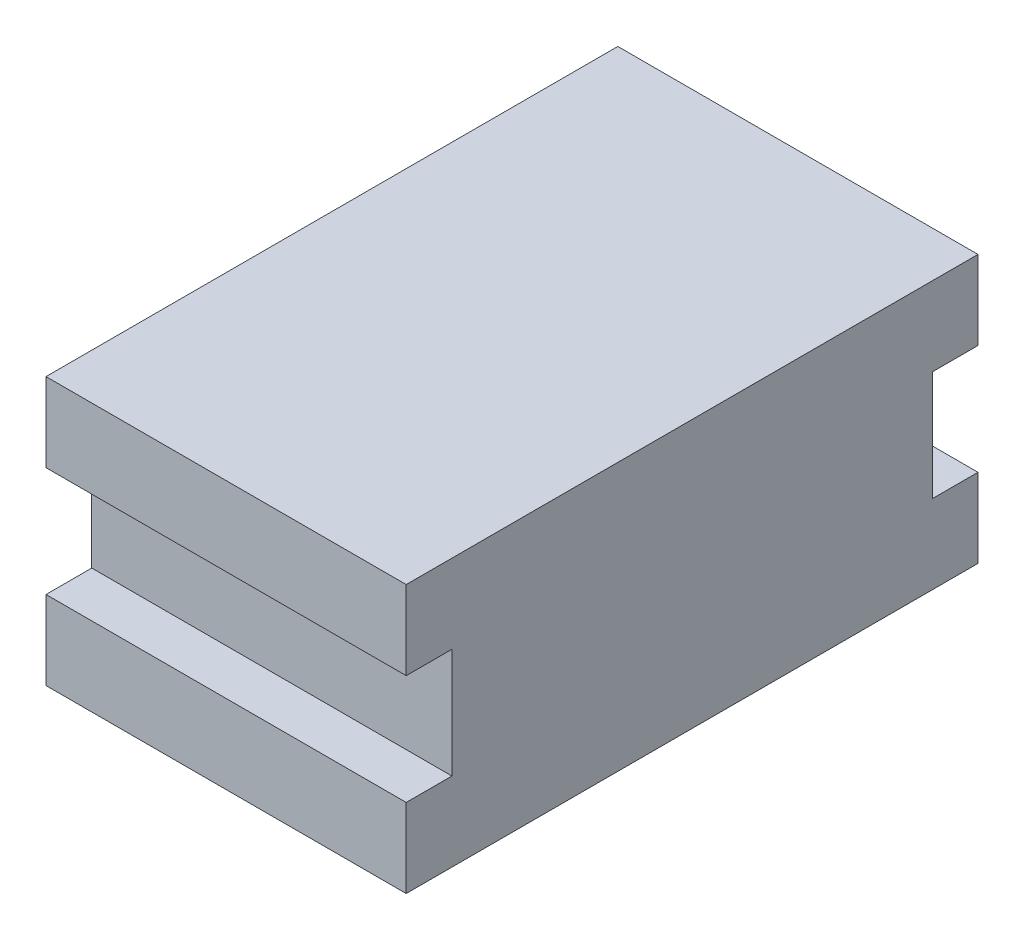
ISO-10303-21;
HEADER;
FILE_DESCRIPTION(('STEP AP214'),'2;1');
FILE_NAME('part.step','',(''),(''),'','','');
FILE_SCHEMA(('AUTOMOTIVE_DESIGN { 1 0 10303 214 1 1 1 1 }'));
ENDSEC;
DATA;
#1=APPLICATION_CONTEXT('core data for automotive mechanical design processes');
#2=APPLICATION_PROTOCOL_DEFINITION('international standard','automotive_design',2000,#1);
#3=PRODUCT_CONTEXT('',#1,'mechanical');
#4=PRODUCT('Part','Part','',(#3));
#5=PRODUCT_RELATED_PRODUCT_CATEGORY('part','',(#4));
#6=PRODUCT_DEFINITION_FORMATION('','',#4);
#7=PRODUCT_DEFINITION_CONTEXT('part definition',#1,'design');
#8=PRODUCT_DEFINITION('design','',#6,#7);
#9=PRODUCT_DEFINITION_SHAPE('','',#8);
#10=(LENGTH_UNIT() NAMED_UNIT(*) SI_UNIT(.MILLI.,.METRE.));
#11=(NAMED_UNIT(*) PLANE_ANGLE_UNIT() SI_UNIT($,.RADIAN.));
#12=(NAMED_UNIT(*) SI_UNIT($,.STERADIAN.) SOLID_ANGLE_UNIT());
#13=UNCERTAINTY_MEASURE_WITH_UNIT(LENGTH_MEASURE(1.E-05),#10,'distance_accuracy_value','');
#14=(GEOMETRIC_REPRESENTATION_CONTEXT(3) GLOBAL_UNCERTAINTY_ASSIGNED_CONTEXT((#13)) GLOBAL_UNIT_ASSIGNED_CONTEXT((#10,
#11,#12)) REPRESENTATION_CONTEXT('',''));
#15=CARTESIAN_POINT('',(0.,0.,0.));
#16=DIRECTION('',(0.,0.,1.));
#17=DIRECTION('',(1.,0.,0.));
#18=AXIS2_PLACEMENT_3D('',#15,#16,#17);
#19=CARTESIAN_POINT('',(0.999998,1.04775,-1.3335));
#20=DIRECTION('',(0.,1.,0.));
#21=DIRECTION('',(0.,0.,1.));
#22=AXIS2_PLACEMENT_3D('',#19,#20,#21);
#23=PLANE('',#22);
#24=DIRECTION('',(1.,0.,0.));
#25=VECTOR('',#24,1.);
#26=CARTESIAN_POINT('',(0.999998,1.04775,-1.5875));
#27=LINE('',#26,#25);
#28=CARTESIAN_POINT('',(-0.999998,1.04775,-1.5875));
#29=VERTEX_POINT('',#28);
#30=CARTESIAN_POINT('',(0.999998,1.04775,-1.5875));
#31=VERTEX_POINT('',#30);
#32=EDGE_CURVE('E145',#29,#31,#27,.T.);
#33=ORIENTED_EDGE('',*,*,#32,.T.);
#34=DIRECTION('',(0.,0.,1.));
#35=VECTOR('',#34,1.);
#36=CARTESIAN_POINT('',(0.999998,1.04775,-1.3335));
#37=LINE('',#36,#35);
#38=CARTESIAN_POINT('',(0.999998,1.04775,-1.3335));
#39=VERTEX_POINT('',#38);
#40=EDGE_CURVE('E20',#39,#31,#37,.F.);
#41=ORIENTED_EDGE('',*,*,#40,.F.);
#42=DIRECTION('',(1.,0.,0.));
#43=VECTOR('',#42,1.);
#44=CARTESIAN_POINT('',(0.999998,1.04775,-1.3335));
#45=LINE('',#44,#43);
#46=CARTESIAN_POINT('',(-0.999998,1.04775,-1.3335));
#47=VERTEX_POINT('',#46);
#48=EDGE_CURVE('E153',#39,#47,#45,.F.);
#49=ORIENTED_EDGE('',*,*,#48,.T.);
#50=DIRECTION('',(0.,0.,1.));
#51=VECTOR('',#50,1.);
#52=CARTESIAN_POINT('',(-0.999998,1.04775,-1.3335));
#53=LINE('',#52,#51);
#54=EDGE_CURVE('E115',#29,#47,#53,.T.);
#55=ORIENTED_EDGE('',*,*,#54,.F.);
#56=EDGE_LOOP('',(#33,#41,#49,#55));
#57=FACE_BOUND('',#56,.T.);
#58=ADVANCED_FACE('F17',(#57),#23,.F.);
#59=CARTESIAN_POINT('',(0.999998,1.04775,1.5875));
#60=DIRECTION('',(0.,1.,0.));
#61=DIRECTION('',(0.,0.,1.));
#62=AXIS2_PLACEMENT_3D('',#59,#60,#61);
#63=PLANE('',#62);
#64=DIRECTION('',(-1.,0.,0.));
#65=VECTOR('',#64,1.);
#66=CARTESIAN_POINT('',(0.999998,1.04775,1.3335));
#67=LINE('',#66,#65);
#68=CARTESIAN_POINT('',(-0.999998,1.04775,1.3335));
#69=VERTEX_POINT('',#68);
#70=CARTESIAN_POINT('',(0.999998,1.04775,1.3335));
#71=VERTEX_POINT('',#70);
#72=EDGE_CURVE('E120',#69,#71,#67,.F.);
#73=ORIENTED_EDGE('',*,*,#72,.T.);
#74=DIRECTION('',(0.,0.,1.));
#75=VECTOR('',#74,1.);
#76=CARTESIAN_POINT('',(0.999998,1.04775,1.5875));
#77=LINE('',#76,#75);
#78=CARTESIAN_POINT('',(0.999998,1.04775,1.5875));
#79=VERTEX_POINT('',#78);
#80=EDGE_CURVE('E107',#79,#71,#77,.F.);
#81=ORIENTED_EDGE('',*,*,#80,.F.);
#82=DIRECTION('',(-1.,0.,0.));
#83=VECTOR('',#82,1.);
#84=CARTESIAN_POINT('',(0.999998,1.04775,1.5875));
#85=LINE('',#84,#83);
#86=CARTESIAN_POINT('',(-0.999998,1.04775,1.5875));
#87=VERTEX_POINT('',#86);
#88=EDGE_CURVE('E171',#79,#87,#85,.T.);
#89=ORIENTED_EDGE('',*,*,#88,.T.);
#90=DIRECTION('',(0.,0.,1.));
#91=VECTOR('',#90,1.);
#92=CARTESIAN_POINT('',(-0.999998,1.04775,1.5875));
#93=LINE('',#92,#91);
#94=EDGE_CURVE('E102',#69,#87,#93,.T.);
#95=ORIENTED_EDGE('',*,*,#94,.F.);
#96=EDGE_LOOP('',(#73,#81,#89,#95));
#97=FACE_BOUND('',#96,.T.);
#98=ADVANCED_FACE('F126',(#97),#63,.F.);
#99=CARTESIAN_POINT('',(0.999998,1.04775,1.3335));
#100=DIRECTION('',(0.,0.,-1.));
#101=DIRECTION('',(-1.,0.,0.));
#102=AXIS2_PLACEMENT_3D('',#99,#100,#101);
#103=PLANE('',#102);
#104=DIRECTION('',(1.,0.,0.));
#105=VECTOR('',#104,1.);
#106=CARTESIAN_POINT('',(0.999998,0.43815,1.3335));
#107=LINE('',#106,#105);
#108=CARTESIAN_POINT('',(-0.999998,0.43815,1.3335));
#109=VERTEX_POINT('',#108);
#110=CARTESIAN_POINT('',(0.999998,0.43815,1.3335));
#111=VERTEX_POINT('',#110);
#112=EDGE_CURVE('E123',#109,#111,#107,.T.);
#113=ORIENTED_EDGE('',*,*,#112,.T.);
#114=DIRECTION('',(0.,1.,0.));
#115=VECTOR('',#114,1.);
#116=CARTESIAN_POINT('',(0.999998,1.04775,1.3335));
#117=LINE('',#116,#115);
#118=EDGE_CURVE('E110',#71,#111,#117,.F.);
#119=ORIENTED_EDGE('',*,*,#118,.F.);
#120=ORIENTED_EDGE('',*,*,#72,.F.);
#121=DIRECTION('',(0.,1.,0.));
#122=VECTOR('',#121,1.);
#123=CARTESIAN_POINT('',(-0.999998,1.04775,1.3335));
#124=LINE('',#123,#122);
#125=EDGE_CURVE('E124',#109,#69,#124,.T.);
#126=ORIENTED_EDGE('',*,*,#125,.F.);
#127=EDGE_LOOP('',(#113,#119,#120,#126));
#128=FACE_BOUND('',#127,.T.);
#129=ADVANCED_FACE('F119',(#128),#103,.F.);
#130=CARTESIAN_POINT('',(0.999998,0.43815,-1.3335));
#131=DIRECTION('',(0.,0.,1.));
#132=DIRECTION('',(1.,0.,0.));
#133=AXIS2_PLACEMENT_3D('',#130,#131,#132);
#134=PLANE('',#133);
#135=ORIENTED_EDGE('',*,*,#48,.F.);
#136=DIRECTION('',(0.,1.,0.));
#137=VECTOR('',#136,1.);
#138=CARTESIAN_POINT('',(0.999998,0.43815,-1.3335));
#139=LINE('',#138,#137);
#140=CARTESIAN_POINT('',(0.999998,0.43815,-1.3335));
#141=VERTEX_POINT('',#140);
#142=EDGE_CURVE('E137',#141,#39,#139,.T.);
#143=ORIENTED_EDGE('',*,*,#142,.F.);
#144=DIRECTION('',(1.,0.,0.));
#145=VECTOR('',#144,1.);
#146=CARTESIAN_POINT('',(0.999998,0.43815,-1.3335));
#147=LINE('',#146,#145);
#148=CARTESIAN_POINT('',(-0.999998,0.43815,-1.3335));
#149=VERTEX_POINT('',#148);
#150=EDGE_CURVE('E189',#141,#149,#147,.F.);
#151=ORIENTED_EDGE('',*,*,#150,.T.);
#152=DIRECTION('',(0.,1.,0.));
#153=VECTOR('',#152,1.);
#154=CARTESIAN_POINT('',(-0.999998,0.43815,-1.3335));
#155=LINE('',#154,#153);
#156=EDGE_CURVE('E151',#47,#149,#155,.F.);
#157=ORIENTED_EDGE('',*,*,#156,.F.);
#158=EDGE_LOOP('',(#135,#143,#151,#157));
#159=FACE_BOUND('',#158,.T.);
#160=ADVANCED_FACE('F196',(#159),#134,.F.);
#161=CARTESIAN_POINT('',(0.999998,1.04775,-1.5875));
#162=DIRECTION('',(0.,0.,1.));
#163=DIRECTION('',(1.,0.,0.));
#164=AXIS2_PLACEMENT_3D('',#161,#162,#163);
#165=PLANE('',#164);
#166=DIRECTION('',(1.,0.,0.));
#167=VECTOR('',#166,1.);
#168=CARTESIAN_POINT('',(0.999998,1.4859,-1.5875));
#169=LINE('',#168,#167);
#170=CARTESIAN_POINT('',(-0.999998,1.4859,-1.5875));
#171=VERTEX_POINT('',#170);
#172=CARTESIAN_POINT('',(0.999998,1.4859,-1.5875));
#173=VERTEX_POINT('',#172);
#174=EDGE_CURVE('E147',#171,#173,#169,.T.);
#175=ORIENTED_EDGE('',*,*,#174,.T.);
#176=DIRECTION('',(0.,1.,0.));
#177=VECTOR('',#176,1.);
#178=CARTESIAN_POINT('',(0.999998,1.04775,-1.5875));
#179=LINE('',#178,#177);
#180=EDGE_CURVE('E134',#31,#173,#179,.T.);
#181=ORIENTED_EDGE('',*,*,#180,.F.);
#182=ORIENTED_EDGE('',*,*,#32,.F.);
#183=DIRECTION('',(0.,1.,0.));
#184=VECTOR('',#183,1.);
#185=CARTESIAN_POINT('',(-0.999998,1.04775,-1.5875));
#186=LINE('',#185,#184);
#187=EDGE_CURVE('E149',#171,#29,#186,.F.);
#188=ORIENTED_EDGE('',*,*,#187,.F.);
#189=EDGE_LOOP('',(#175,#181,#182,#188));
#190=FACE_BOUND('',#189,.T.);
#191=ADVANCED_FACE('F144',(#190),#165,.F.);
#192=CARTESIAN_POINT('',(0.999998,1.4859,1.5875));
#193=DIRECTION('',(0.,0.,-1.));
#194=DIRECTION('',(-1.,0.,0.));
#195=AXIS2_PLACEMENT_3D('',#192,#193,#194);
#196=PLANE('',#195);
#197=ORIENTED_EDGE('',*,*,#88,.F.);
#198=DIRECTION('',(0.,1.,0.));
#199=VECTOR('',#198,1.);
#200=CARTESIAN_POINT('',(0.999998,1.4859,1.5875));
#201=LINE('',#200,#199);
#202=CARTESIAN_POINT('',(0.999998,1.4859,1.5875));
#203=VERTEX_POINT('',#202);
#204=EDGE_CURVE('E113',#203,#79,#201,.F.);
#205=ORIENTED_EDGE('',*,*,#204,.F.);
#206=DIRECTION('',(1.,0.,0.));
#207=VECTOR('',#206,1.);
#208=CARTESIAN_POINT('',(0.999998,1.4859,1.5875));
#209=LINE('',#208,#207);
#210=CARTESIAN_POINT('',(-0.999998,1.4859,1.5875));
#211=VERTEX_POINT('',#210);
#212=EDGE_CURVE('E183',#203,#211,#209,.F.);
#213=ORIENTED_EDGE('',*,*,#212,.T.);
#214=DIRECTION('',(0.,1.,0.));
#215=VECTOR('',#214,1.);
#216=CARTESIAN_POINT('',(-0.999998,1.4859,1.5875));
#217=LINE('',#216,#215);
#218=EDGE_CURVE('E168',#87,#211,#217,.T.);
#219=ORIENTED_EDGE('',*,*,#218,.F.);
#220=EDGE_LOOP('',(#197,#205,#213,#219));
#221=FACE_BOUND('',#220,.T.);
#222=ADVANCED_FACE('F299',(#221),#196,.F.);
#223=CARTESIAN_POINT('',(0.999998,0.43815,1.3335));
#224=DIRECTION('',(0.,-1.,0.));
#225=DIRECTION('',(0.,0.,-1.));
#226=AXIS2_PLACEMENT_3D('',#223,#224,#225);
#227=PLANE('',#226);
#228=DIRECTION('',(-1.,0.,0.));
#229=VECTOR('',#228,1.);
#230=CARTESIAN_POINT('',(0.999998,0.43815,1.5875));
#231=LINE('',#230,#229);
#232=CARTESIAN_POINT('',(-0.999998,0.43815,1.5875));
#233=VERTEX_POINT('',#232);
#234=CARTESIAN_POINT('',(0.999998,0.43815,1.5875));
#235=VERTEX_POINT('',#234);
#236=EDGE_CURVE('E187',#233,#235,#231,.F.);
#237=ORIENTED_EDGE('',*,*,#236,.T.);
#238=DIRECTION('',(0.,0.,-1.));
#239=VECTOR('',#238,1.);
#240=CARTESIAN_POINT('',(0.999998,0.43815,1.3335));
#241=LINE('',#240,#239);
#242=EDGE_CURVE('E167',#111,#235,#241,.F.);
#243=ORIENTED_EDGE('',*,*,#242,.F.);
#244=ORIENTED_EDGE('',*,*,#112,.F.);
#245=DIRECTION('',(0.,0.,-1.));
#246=VECTOR('',#245,1.);
#247=CARTESIAN_POINT('',(-0.999998,0.43815,1.3335));
#248=LINE('',#247,#246);
#249=EDGE_CURVE('E162',#233,#109,#248,.T.);
#250=ORIENTED_EDGE('',*,*,#249,.F.);
#251=EDGE_LOOP('',(#237,#243,#244,#250));
#252=FACE_BOUND('',#251,.T.);
#253=ADVANCED_FACE('F165',(#252),#227,.F.);
#254=CARTESIAN_POINT('',(0.999998,0.43815,-1.5875));
#255=DIRECTION('',(0.,-1.,0.));
#256=DIRECTION('',(0.,0.,-1.));
#257=AXIS2_PLACEMENT_3D('',#254,#255,#256);
#258=PLANE('',#257);
#259=ORIENTED_EDGE('',*,*,#150,.F.);
#260=DIRECTION('',(0.,0.,-1.));
#261=VECTOR('',#260,1.);
#262=CARTESIAN_POINT('',(0.999998,0.43815,0.));
#263=LINE('',#262,#261);
#264=CARTESIAN_POINT('',(0.999998,0.43815,-1.5875));
#265=VERTEX_POINT('',#264);
#266=EDGE_CURVE('E201',#265,#141,#263,.F.);
#267=ORIENTED_EDGE('',*,*,#266,.F.);
#268=DIRECTION('',(1.,0.,0.));
#269=VECTOR('',#268,1.);
#270=CARTESIAN_POINT('',(0.999998,0.43815,-1.5875));
#271=LINE('',#270,#269);
#272=CARTESIAN_POINT('',(-0.999998,0.43815,-1.5875));
#273=VERTEX_POINT('',#272);
#274=EDGE_CURVE('E231',#265,#273,#271,.F.);
#275=ORIENTED_EDGE('',*,*,#274,.T.);
#276=DIRECTION('',(0.,0.,-1.));
#277=VECTOR('',#276,1.);
#278=CARTESIAN_POINT('',(-0.999998,0.43815,-1.5875));
#279=LINE('',#278,#277);
#280=EDGE_CURVE('E184',#149,#273,#279,.T.);
#281=ORIENTED_EDGE('',*,*,#280,.F.);
#282=EDGE_LOOP('',(#259,#267,#275,#281));
#283=FACE_BOUND('',#282,.T.);
#284=ADVANCED_FACE('F199',(#283),#258,.F.);
#285=CARTESIAN_POINT('',(0.999998,1.4859,-1.5875));
#286=DIRECTION('',(0.,-1.,0.));
#287=DIRECTION('',(0.,0.,-1.));
#288=AXIS2_PLACEMENT_3D('',#285,#286,#287);
#289=PLANE('',#288);
#290=ORIENTED_EDGE('',*,*,#212,.F.);
#291=DIRECTION('',(0.,0.,-1.));
#292=VECTOR('',#291,1.);
#293=CARTESIAN_POINT('',(0.999998,1.4859,0.));
#294=LINE('',#293,#292);
#295=EDGE_CURVE('E182',#173,#203,#294,.F.);
#296=ORIENTED_EDGE('',*,*,#295,.F.);
#297=ORIENTED_EDGE('',*,*,#174,.F.);
#298=DIRECTION('',(0.,0.,-1.));
#299=VECTOR('',#298,1.);
#300=CARTESIAN_POINT('',(-0.999998,1.4859,0.));
#301=LINE('',#300,#299);
#302=EDGE_CURVE('E178',#171,#211,#301,.F.);
#303=ORIENTED_EDGE('',*,*,#302,.T.);
#304=EDGE_LOOP('',(#290,#296,#297,#303));
#305=FACE_BOUND('',#304,.T.);
#306=ADVANCED_FACE('F181',(#305),#289,.F.);
#307=CARTESIAN_POINT('',(0.999998,0.43815,1.5875));
#308=DIRECTION('',(0.,0.,-1.));
#309=DIRECTION('',(-1.,0.,0.));
#310=AXIS2_PLACEMENT_3D('',#307,#308,#309);
#311=PLANE('',#310);
#312=DIRECTION('',(1.,0.,0.));
#313=VECTOR('',#312,1.);
#314=CARTESIAN_POINT('',(0.999998,0.,1.5875));
#315=LINE('',#314,#313);
#316=CARTESIAN_POINT('',(-0.999998,0.,1.5875));
#317=VERTEX_POINT('',#316);
#318=CARTESIAN_POINT('',(0.999998,0.,1.5875));
#319=VERTEX_POINT('',#318);
#320=EDGE_CURVE('E216',#317,#319,#315,.T.);
#321=ORIENTED_EDGE('',*,*,#320,.T.);
#322=DIRECTION('',(0.,1.,0.));
#323=VECTOR('',#322,1.);
#324=CARTESIAN_POINT('',(0.999998,0.,1.5875));
#325=LINE('',#324,#323);
#326=EDGE_CURVE('E206',#235,#319,#325,.F.);
#327=ORIENTED_EDGE('',*,*,#326,.F.);
#328=ORIENTED_EDGE('',*,*,#236,.F.);
#329=DIRECTION('',(0.,1.,0.));
#330=VECTOR('',#329,1.);
#331=CARTESIAN_POINT('',(-0.999998,0.,1.5875));
#332=LINE('',#331,#330);
#333=EDGE_CURVE('E225',#233,#317,#332,.F.);
#334=ORIENTED_EDGE('',*,*,#333,.T.);
#335=EDGE_LOOP('',(#321,#327,#328,#334));
#336=FACE_BOUND('',#335,.T.);
#337=ADVANCED_FACE('F215',(#336),#311,.F.);
#338=CARTESIAN_POINT('',(0.999998,0.,0.));
#339=DIRECTION('',(1.,0.,0.));
#340=DIRECTION('',(0.,0.,-1.));
#341=AXIS2_PLACEMENT_3D('',#338,#339,#340);
#342=PLANE('',#341);
#343=ORIENTED_EDGE('',*,*,#118,.T.);
#344=ORIENTED_EDGE('',*,*,#242,.T.);
#345=ORIENTED_EDGE('',*,*,#326,.T.);
#346=DIRECTION('',(0.,0.,1.));
#347=VECTOR('',#346,1.);
#348=CARTESIAN_POINT('',(0.999998,0.,1.5875));
#349=LINE('',#348,#347);
#350=CARTESIAN_POINT('',(0.999998,0.,-1.5875));
#351=VERTEX_POINT('',#350);
#352=EDGE_CURVE('E218',#319,#351,#349,.F.);
#353=ORIENTED_EDGE('',*,*,#352,.T.);
#354=DIRECTION('',(0.,1.,0.));
#355=VECTOR('',#354,1.);
#356=CARTESIAN_POINT('',(0.999998,0.,-1.5875));
#357=LINE('',#356,#355);
#358=EDGE_CURVE('E205',#351,#265,#357,.T.);
#359=ORIENTED_EDGE('',*,*,#358,.T.);
#360=ORIENTED_EDGE('',*,*,#266,.T.);
#361=ORIENTED_EDGE('',*,*,#142,.T.);
#362=ORIENTED_EDGE('',*,*,#40,.T.);
#363=ORIENTED_EDGE('',*,*,#180,.T.);
#364=ORIENTED_EDGE('',*,*,#295,.T.);
#365=ORIENTED_EDGE('',*,*,#204,.T.);
#366=ORIENTED_EDGE('',*,*,#80,.T.);
#367=EDGE_LOOP('',(#343,#344,#345,#353,#359,#360,#361,#362,#363,#364,#365,#366));
#368=FACE_BOUND('',#367,.T.);
#369=ADVANCED_FACE('F109',(#368),#342,.T.);
#370=CARTESIAN_POINT('',(0.999998,0.,-1.5875));
#371=DIRECTION('',(0.,0.,1.));
#372=DIRECTION('',(1.,0.,0.));
#373=AXIS2_PLACEMENT_3D('',#370,#371,#372);
#374=PLANE('',#373);
#375=ORIENTED_EDGE('',*,*,#274,.F.);
#376=ORIENTED_EDGE('',*,*,#358,.F.);
#377=DIRECTION('',(1.,0.,0.));
#378=VECTOR('',#377,1.);
#379=CARTESIAN_POINT('',(0.999998,0.,-1.5875));
#380=LINE('',#379,#378);
#381=CARTESIAN_POINT('',(-0.999998,0.,-1.5875));
#382=VERTEX_POINT('',#381);
#383=EDGE_CURVE('E26',#351,#382,#380,.F.);
#384=ORIENTED_EDGE('',*,*,#383,.T.);
#385=DIRECTION('',(0.,1.,0.));
#386=VECTOR('',#385,1.);
#387=CARTESIAN_POINT('',(-0.999998,0.,-1.5875));
#388=LINE('',#387,#386);
#389=EDGE_CURVE('E34',#382,#273,#388,.T.);
#390=ORIENTED_EDGE('',*,*,#389,.T.);
#391=EDGE_LOOP('',(#375,#376,#384,#390));
#392=FACE_BOUND('',#391,.T.);
#393=ADVANCED_FACE('F233',(#392),#374,.F.);
#394=CARTESIAN_POINT('',(-0.999998,0.,0.));
#395=DIRECTION('',(1.,0.,0.));
#396=DIRECTION('',(0.,0.,-1.));
#397=AXIS2_PLACEMENT_3D('',#394,#395,#396);
#398=PLANE('',#397);
#399=ORIENTED_EDGE('',*,*,#249,.T.);
#400=ORIENTED_EDGE('',*,*,#125,.T.);
#401=ORIENTED_EDGE('',*,*,#94,.T.);
#402=ORIENTED_EDGE('',*,*,#218,.T.);
#403=ORIENTED_EDGE('',*,*,#302,.F.);
#404=ORIENTED_EDGE('',*,*,#187,.T.);
#405=ORIENTED_EDGE('',*,*,#54,.T.);
#406=ORIENTED_EDGE('',*,*,#156,.T.);
#407=ORIENTED_EDGE('',*,*,#280,.T.);
#408=ORIENTED_EDGE('',*,*,#389,.F.);
#409=DIRECTION('',(0.,0.,1.));
#410=VECTOR('',#409,1.);
#411=CARTESIAN_POINT('',(-0.999998,0.,1.5875));
#412=LINE('',#411,#410);
#413=EDGE_CURVE('E11',#382,#317,#412,.T.);
#414=ORIENTED_EDGE('',*,*,#413,.T.);
#415=ORIENTED_EDGE('',*,*,#333,.F.);
#416=EDGE_LOOP('',(#399,#400,#401,#402,#403,#404,#405,#406,#407,#408,#414,#415));
#417=FACE_BOUND('',#416,.T.);
#418=ADVANCED_FACE('F159',(#417),#398,.F.);
#419=CARTESIAN_POINT('',(0.999998,0.,1.5875));
#420=DIRECTION('',(0.,1.,0.));
#421=DIRECTION('',(0.,0.,1.));
#422=AXIS2_PLACEMENT_3D('',#419,#420,#421);
#423=PLANE('',#422);
#424=ORIENTED_EDGE('',*,*,#383,.F.);
#425=ORIENTED_EDGE('',*,*,#352,.F.);
#426=ORIENTED_EDGE('',*,*,#320,.F.);
#427=ORIENTED_EDGE('',*,*,#413,.F.);
#428=EDGE_LOOP('',(#424,#425,#426,#427));
#429=FACE_BOUND('',#428,.T.);
#430=ADVANCED_FACE('F221',(#429),#423,.F.);
#431=CLOSED_SHELL('',(#58,#98,#129,#160,#191,#222,#253,#284,#306,#337,#369,#393,#418,#430));
#432=MANIFOLD_SOLID_BREP('B1',#431);
#433=ADVANCED_BREP_SHAPE_REPRESENTATION('',(#18,#432),#14);
#434=SHAPE_DEFINITION_REPRESENTATION(#9,#433);
ENDSEC;
END-ISO-10303-21;
